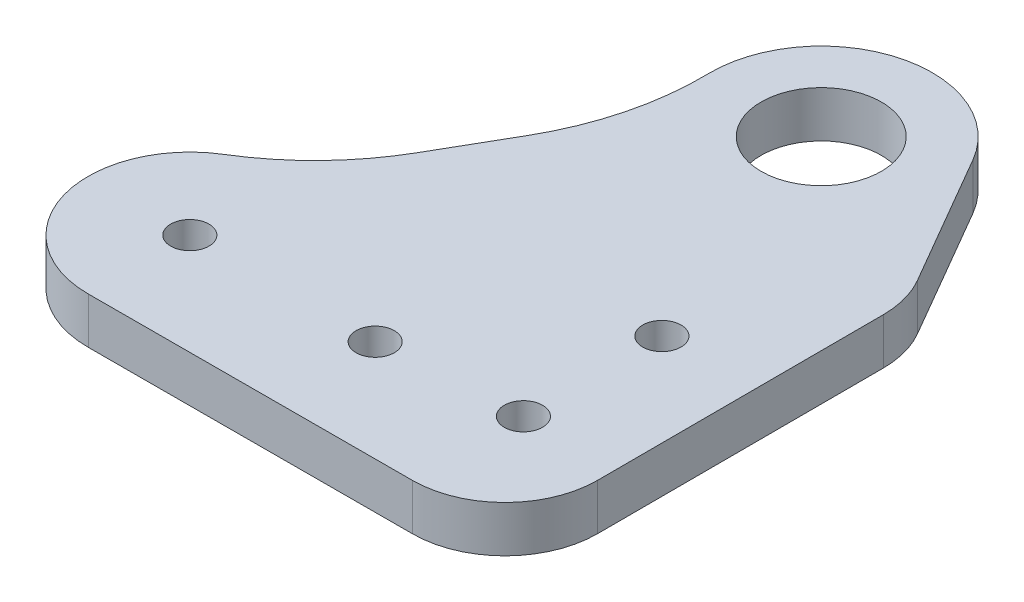
ISO-10303-21;
HEADER;
FILE_DESCRIPTION(('STEP AP214'),'2;1');
FILE_NAME('part.step','',(''),(''),'','','');
FILE_SCHEMA(('AUTOMOTIVE_DESIGN { 1 0 10303 214 1 1 1 1 }'));
ENDSEC;
DATA;
#1=APPLICATION_CONTEXT('core data for automotive mechanical design processes');
#2=APPLICATION_PROTOCOL_DEFINITION('international standard','automotive_design',2000,#1);
#3=PRODUCT_CONTEXT('',#1,'mechanical');
#4=PRODUCT('Part','Part','',(#3));
#5=PRODUCT_RELATED_PRODUCT_CATEGORY('part','',(#4));
#6=PRODUCT_DEFINITION_FORMATION('','',#4);
#7=PRODUCT_DEFINITION_CONTEXT('part definition',#1,'design');
#8=PRODUCT_DEFINITION('design','',#6,#7);
#9=PRODUCT_DEFINITION_SHAPE('','',#8);
#10=(LENGTH_UNIT() NAMED_UNIT(*) SI_UNIT(.MILLI.,.METRE.));
#11=(NAMED_UNIT(*) PLANE_ANGLE_UNIT() SI_UNIT($,.RADIAN.));
#12=(NAMED_UNIT(*) SI_UNIT($,.STERADIAN.) SOLID_ANGLE_UNIT());
#13=UNCERTAINTY_MEASURE_WITH_UNIT(LENGTH_MEASURE(1.E-05),#10,'distance_accuracy_value','');
#14=(GEOMETRIC_REPRESENTATION_CONTEXT(3) GLOBAL_UNCERTAINTY_ASSIGNED_CONTEXT((#13)) GLOBAL_UNIT_ASSIGNED_CONTEXT((#10,
#11,#12)) REPRESENTATION_CONTEXT('',''));
#15=CARTESIAN_POINT('',(0.,0.,0.));
#16=DIRECTION('',(0.,0.,1.));
#17=DIRECTION('',(1.,0.,0.));
#18=AXIS2_PLACEMENT_3D('',#15,#16,#17);
#19=CARTESIAN_POINT('',(18.9926734601036,5.,23.7671106439269));
#20=DIRECTION('',(0.,1.,0.));
#21=DIRECTION('',(0.,0.,1.));
#22=AXIS2_PLACEMENT_3D('',#19,#20,#21);
#23=PLANE('',#22);
#24=CARTESIAN_POINT('',(18.9589575027186,5.,6.76714407478896));
#25=DIRECTION('',(0.,1.,0.));
#26=DIRECTION('',(0.,0.,1.));
#27=AXIS2_PLACEMENT_3D('',#24,#25,#26);
#28=CIRCLE('',#27,2.06999999999918);
#29=CARTESIAN_POINT('',(18.9589575027186,5.,8.83714407478813));
#30=VERTEX_POINT('',#29);
#31=EDGE_CURVE('E265',#30,#30,#28,.T.);
#32=ORIENTED_EDGE('',*,*,#31,.F.);
#33=EDGE_LOOP('',(#32));
#34=FACE_BOUND('',#33,.T.);
#35=CARTESIAN_POINT('',(3.99071966935888,5.,22.7968619813518));
#36=DIRECTION('',(0.,1.,0.));
#37=DIRECTION('',(0.,0.,1.));
#38=AXIS2_PLACEMENT_3D('',#35,#36,#37);
#39=CIRCLE('',#38,2.06999999999918);
#40=CARTESIAN_POINT('',(3.99071966935888,5.,24.866861981351));
#41=VERTEX_POINT('',#40);
#42=EDGE_CURVE('E249',#41,#41,#39,.T.);
#43=ORIENTED_EDGE('',*,*,#42,.F.);
#44=EDGE_LOOP('',(#43));
#45=FACE_BOUND('',#44,.T.);
#46=CARTESIAN_POINT('',(18.9926734601036,5.,23.7671106439269));
#47=DIRECTION('',(0.,1.,0.));
#48=DIRECTION('',(0.,0.,1.));
#49=AXIS2_PLACEMENT_3D('',#46,#47,#48);
#50=CIRCLE('',#49,10.0000000000019);
#51=CARTESIAN_POINT('',(19.0125063762094,5.,33.7670909766814));
#52=VERTEX_POINT('',#51);
#53=CARTESIAN_POINT('',(28.9926537928581,5.,23.7472777278211));
#54=VERTEX_POINT('',#53);
#55=EDGE_CURVE('E182',#52,#54,#50,.T.);
#56=ORIENTED_EDGE('',*,*,#55,.T.);
#57=DIRECTION('',(-0.00198329161057745,0.,-0.99999803327526));
#58=VECTOR('',#57,1.);
#59=CARTESIAN_POINT('',(28.9926537928581,5.,23.7472777278211));
#60=LINE('',#59,#58);
#61=CARTESIAN_POINT('',(28.9312099072621,5.,-7.23342345858589));
#62=VERTEX_POINT('',#61);
#63=EDGE_CURVE('E106',#54,#62,#60,.T.);
#64=ORIENTED_EDGE('',*,*,#63,.T.);
#65=CARTESIAN_POINT('',(18.9312295745076,5.,-7.21359054248011));
#66=DIRECTION('',(0.,1.,0.));
#67=DIRECTION('',(0.,0.,1.));
#68=AXIS2_PLACEMENT_3D('',#65,#66,#67);
#69=CIRCLE('',#68,10.0000000000019);
#70=CARTESIAN_POINT('',(27.5815501219633,5.,-12.2307565180387));
#71=VERTEX_POINT('',#70);
#72=EDGE_CURVE('E211',#62,#71,#69,.T.);
#73=ORIENTED_EDGE('',*,*,#72,.T.);
#74=DIRECTION('',(-0.501716597555765,0.,-0.86503205474541));
#75=VECTOR('',#74,1.);
#76=CARTESIAN_POINT('',(27.5815501219633,5.,-12.2307565180387));
#77=LINE('',#76,#75);
#78=CARTESIAN_POINT('',(19.285215446797,5.,-26.5348386749323));
#79=VERTEX_POINT('',#78);
#80=EDGE_CURVE('E231',#71,#79,#77,.T.);
#81=ORIENTED_EDGE('',*,*,#80,.T.);
#82=CARTESIAN_POINT('',(8.90483078985219,5.,-20.5142395042632));
#83=DIRECTION('',(0.,1.,0.));
#84=DIRECTION('',(0.,0.,1.));
#85=AXIS2_PLACEMENT_3D('',#82,#83,#84);
#86=CIRCLE('',#85,11.9999999999998);
#87=CARTESIAN_POINT('',(-3.0928915145525,5.,-20.2804457781161));
#88=VERTEX_POINT('',#87);
#89=EDGE_CURVE('E227',#79,#88,#86,.T.);
#90=ORIENTED_EDGE('',*,*,#89,.T.);
#91=CARTESIAN_POINT('',(-33.0871972755709,5.,-19.6959614627483));
#92=DIRECTION('',(0.,-1.,0.));
#93=DIRECTION('',(0.,0.,1.));
#94=AXIS2_PLACEMENT_3D('',#91,#92,#93);
#95=CIRCLE('',#94,30.0000000000062);
#96=CARTESIAN_POINT('',(-7.07673688342201,5.,-4.74751839369167));
#97=VERTEX_POINT('',#96);
#98=EDGE_CURVE('E230',#88,#97,#95,.T.);
#99=ORIENTED_EDGE('',*,*,#98,.T.);
#100=DIRECTION('',(-0.498281435635117,0.,0.867015346404784));
#101=VECTOR('',#100,1.);
#102=CARTESIAN_POINT('',(-7.07673688342201,5.,-4.74751839369167));
#103=LINE('',#102,#101);
#104=CARTESIAN_POINT('',(-11.4343453038056,5.,2.83476965458697));
#105=VERTEX_POINT('',#104);
#106=EDGE_CURVE('E131',#97,#105,#103,.T.);
#107=ORIENTED_EDGE('',*,*,#106,.T.);
#108=CARTESIAN_POINT('',(-37.4448056959545,5.,-12.1136734144696));
#109=DIRECTION('',(0.,-1.,0.));
#110=DIRECTION('',(0.,0.,1.));
#111=AXIS2_PLACEMENT_3D('',#108,#109,#110);
#112=CIRCLE('',#111,30.0000000000062);
#113=CARTESIAN_POINT('',(-21.7602461615812,5.,13.4596445597994));
#114=VERTEX_POINT('',#113);
#115=EDGE_CURVE('E125',#105,#114,#112,.T.);
#116=ORIENTED_EDGE('',*,*,#115,.T.);
#117=CARTESIAN_POINT('',(-16.0092409989788,5.,22.8365278170294));
#118=DIRECTION('',(0.,1.,0.));
#119=DIRECTION('',(0.,0.,1.));
#120=AXIS2_PLACEMENT_3D('',#117,#118,#119);
#121=CIRCLE('',#120,11.);
#122=CARTESIAN_POINT('',(-15.9874247912625,5.,33.8365061830573));
#123=VERTEX_POINT('',#122);
#124=EDGE_CURVE('E129',#114,#123,#121,.T.);
#125=ORIENTED_EDGE('',*,*,#124,.T.);
#126=DIRECTION('',(0.99999803327526,0.,-0.00198329161057758));
#127=VECTOR('',#126,1.);
#128=CARTESIAN_POINT('',(-15.9874247912625,5.,33.8365061830573));
#129=LINE('',#128,#127);
#130=EDGE_CURVE('E57',#123,#52,#129,.T.);
#131=ORIENTED_EDGE('',*,*,#130,.T.);
#132=EDGE_LOOP('',(#56,#64,#73,#81,#90,#99,#107,#116,#125,#131));
#133=FACE_BOUND('',#132,.T.);
#134=CARTESIAN_POINT('',(-16.0092409989788,5.,22.8365278170294));
#135=DIRECTION('',(0.,1.,0.));
#136=DIRECTION('',(0.,0.,1.));
#137=AXIS2_PLACEMENT_3D('',#134,#135,#136);
#138=CIRCLE('',#137,2.07000000372127);
#139=CARTESIAN_POINT('',(-16.0092409989788,5.,24.9065278207507));
#140=VERTEX_POINT('',#139);
#141=EDGE_CURVE('E158',#140,#140,#138,.T.);
#142=ORIENTED_EDGE('',*,*,#141,.F.);
#143=EDGE_LOOP('',(#142));
#144=FACE_BOUND('',#143,.T.);
#145=CARTESIAN_POINT('',(18.9887068768774,5.,21.767114573918));
#146=DIRECTION('',(0.,1.,0.));
#147=DIRECTION('',(0.,0.,1.));
#148=AXIS2_PLACEMENT_3D('',#145,#146,#147);
#149=CIRCLE('',#148,2.06999999999911);
#150=CARTESIAN_POINT('',(18.9887068768774,5.,23.8371145739171));
#151=VERTEX_POINT('',#150);
#152=EDGE_CURVE('E257',#151,#151,#149,.T.);
#153=ORIENTED_EDGE('',*,*,#152,.F.);
#154=EDGE_LOOP('',(#153));
#155=FACE_BOUND('',#154,.T.);
#156=CARTESIAN_POINT('',(8.9048307898522,5.,-20.5142395042632));
#157=DIRECTION('',(0.,1.,0.));
#158=DIRECTION('',(0.,0.,1.));
#159=AXIS2_PLACEMENT_3D('',#156,#157,#158);
#160=CIRCLE('',#159,6.49999999999992);
#161=CARTESIAN_POINT('',(8.9048307898522,5.,-14.0142395042633));
#162=VERTEX_POINT('',#161);
#163=EDGE_CURVE('E273',#162,#162,#160,.T.);
#164=ORIENTED_EDGE('',*,*,#163,.F.);
#165=EDGE_LOOP('',(#164));
#166=FACE_BOUND('',#165,.T.);
#167=ADVANCED_FACE('F39',(#34,#45,#133,#144,#155,#166),#23,.T.);
#168=CARTESIAN_POINT('',(18.9926734601036,0.,23.7671106439269));
#169=DIRECTION('',(0.,1.,0.));
#170=DIRECTION('',(0.,0.,1.));
#171=AXIS2_PLACEMENT_3D('',#168,#169,#170);
#172=PLANE('',#171);
#173=CARTESIAN_POINT('',(18.9926734601036,0.,23.7671106439269));
#174=DIRECTION('',(0.,1.,0.));
#175=DIRECTION('',(0.,0.,1.));
#176=AXIS2_PLACEMENT_3D('',#173,#174,#175);
#177=CIRCLE('',#176,10.0000000000019);
#178=CARTESIAN_POINT('',(19.0125063762094,0.,33.7670909766814));
#179=VERTEX_POINT('',#178);
#180=CARTESIAN_POINT('',(28.9926537928581,0.,23.7472777278211));
#181=VERTEX_POINT('',#180);
#182=EDGE_CURVE('E153',#179,#181,#177,.T.);
#183=ORIENTED_EDGE('',*,*,#182,.F.);
#184=DIRECTION('',(0.99999803327526,0.,-0.00198329161057758));
#185=VECTOR('',#184,1.);
#186=CARTESIAN_POINT('',(-15.9874247912625,0.,33.8365061830573));
#187=LINE('',#186,#185);
#188=CARTESIAN_POINT('',(-15.9874247912625,0.,33.8365061830573));
#189=VERTEX_POINT('',#188);
#190=EDGE_CURVE('E98',#189,#179,#187,.T.);
#191=ORIENTED_EDGE('',*,*,#190,.F.);
#192=CARTESIAN_POINT('',(-16.0092409989788,0.,22.8365278170294));
#193=DIRECTION('',(0.,1.,0.));
#194=DIRECTION('',(0.,0.,1.));
#195=AXIS2_PLACEMENT_3D('',#192,#193,#194);
#196=CIRCLE('',#195,11.);
#197=CARTESIAN_POINT('',(-21.7602461615812,0.,13.4596445597994));
#198=VERTEX_POINT('',#197);
#199=EDGE_CURVE('E92',#198,#189,#196,.T.);
#200=ORIENTED_EDGE('',*,*,#199,.F.);
#201=CARTESIAN_POINT('',(-37.4448056959545,0.,-12.1136734144696));
#202=DIRECTION('',(0.,-1.,0.));
#203=DIRECTION('',(0.,0.,1.));
#204=AXIS2_PLACEMENT_3D('',#201,#202,#203);
#205=CIRCLE('',#204,30.0000000000062);
#206=CARTESIAN_POINT('',(-11.4343453038056,0.,2.83476965458697));
#207=VERTEX_POINT('',#206);
#208=EDGE_CURVE('E140',#207,#198,#205,.T.);
#209=ORIENTED_EDGE('',*,*,#208,.F.);
#210=DIRECTION('',(-0.498281435635117,0.,0.867015346404784));
#211=VECTOR('',#210,1.);
#212=CARTESIAN_POINT('',(-7.07673688342201,0.,-4.74751839369167));
#213=LINE('',#212,#211);
#214=CARTESIAN_POINT('',(-7.07673688342201,0.,-4.74751839369167));
#215=VERTEX_POINT('',#214);
#216=EDGE_CURVE('E173',#215,#207,#213,.T.);
#217=ORIENTED_EDGE('',*,*,#216,.F.);
#218=CARTESIAN_POINT('',(-33.0871972755709,0.,-19.6959614627483));
#219=DIRECTION('',(0.,-1.,0.));
#220=DIRECTION('',(0.,0.,1.));
#221=AXIS2_PLACEMENT_3D('',#218,#219,#220);
#222=CIRCLE('',#221,30.0000000000062);
#223=CARTESIAN_POINT('',(-3.0928915145525,0.,-20.2804457781161));
#224=VERTEX_POINT('',#223);
#225=EDGE_CURVE('E170',#224,#215,#222,.T.);
#226=ORIENTED_EDGE('',*,*,#225,.F.);
#227=CARTESIAN_POINT('',(8.90483078985219,0.,-20.5142395042632));
#228=DIRECTION('',(0.,1.,0.));
#229=DIRECTION('',(0.,0.,1.));
#230=AXIS2_PLACEMENT_3D('',#227,#228,#229);
#231=CIRCLE('',#230,11.9999999999998);
#232=CARTESIAN_POINT('',(19.285215446797,0.,-26.5348386749323));
#233=VERTEX_POINT('',#232);
#234=EDGE_CURVE('E167',#233,#224,#231,.T.);
#235=ORIENTED_EDGE('',*,*,#234,.F.);
#236=DIRECTION('',(-0.501716597555765,0.,-0.86503205474541));
#237=VECTOR('',#236,1.);
#238=CARTESIAN_POINT('',(27.5815501219633,0.,-12.2307565180387));
#239=LINE('',#238,#237);
#240=CARTESIAN_POINT('',(27.5815501219633,0.,-12.2307565180387));
#241=VERTEX_POINT('',#240);
#242=EDGE_CURVE('E164',#241,#233,#239,.T.);
#243=ORIENTED_EDGE('',*,*,#242,.F.);
#244=CARTESIAN_POINT('',(18.9312295745076,0.,-7.21359054248011));
#245=DIRECTION('',(0.,1.,0.));
#246=DIRECTION('',(0.,0.,1.));
#247=AXIS2_PLACEMENT_3D('',#244,#245,#246);
#248=CIRCLE('',#247,10.0000000000019);
#249=CARTESIAN_POINT('',(28.9312099072621,0.,-7.23342345858589));
#250=VERTEX_POINT('',#249);
#251=EDGE_CURVE('E161',#250,#241,#248,.T.);
#252=ORIENTED_EDGE('',*,*,#251,.F.);
#253=DIRECTION('',(-0.00198329161057745,0.,-0.99999803327526));
#254=VECTOR('',#253,1.);
#255=CARTESIAN_POINT('',(28.9926537928581,0.,23.7472777278211));
#256=LINE('',#255,#254);
#257=EDGE_CURVE('E157',#181,#250,#256,.T.);
#258=ORIENTED_EDGE('',*,*,#257,.F.);
#259=EDGE_LOOP('',(#183,#191,#200,#209,#217,#226,#235,#243,#252,#258));
#260=FACE_BOUND('',#259,.T.);
#261=CARTESIAN_POINT('',(-16.0092409989788,0.,22.8365278170294));
#262=DIRECTION('',(0.,1.,0.));
#263=DIRECTION('',(0.,0.,1.));
#264=AXIS2_PLACEMENT_3D('',#261,#262,#263);
#265=CIRCLE('',#264,2.07000000372127);
#266=CARTESIAN_POINT('',(-16.0092409989788,0.,24.9065278207507));
#267=VERTEX_POINT('',#266);
#268=EDGE_CURVE('E245',#267,#267,#265,.T.);
#269=ORIENTED_EDGE('',*,*,#268,.T.);
#270=EDGE_LOOP('',(#269));
#271=FACE_BOUND('',#270,.T.);
#272=CARTESIAN_POINT('',(3.99071966935888,0.,22.7968619813518));
#273=DIRECTION('',(0.,1.,0.));
#274=DIRECTION('',(0.,0.,1.));
#275=AXIS2_PLACEMENT_3D('',#272,#273,#274);
#276=CIRCLE('',#275,2.06999999999918);
#277=CARTESIAN_POINT('',(3.99071966935888,0.,24.866861981351));
#278=VERTEX_POINT('',#277);
#279=EDGE_CURVE('E253',#278,#278,#276,.T.);
#280=ORIENTED_EDGE('',*,*,#279,.T.);
#281=EDGE_LOOP('',(#280));
#282=FACE_BOUND('',#281,.T.);
#283=CARTESIAN_POINT('',(18.9887068768774,0.,21.767114573918));
#284=DIRECTION('',(0.,1.,0.));
#285=DIRECTION('',(0.,0.,1.));
#286=AXIS2_PLACEMENT_3D('',#283,#284,#285);
#287=CIRCLE('',#286,2.06999999999911);
#288=CARTESIAN_POINT('',(18.9887068768774,0.,23.8371145739171));
#289=VERTEX_POINT('',#288);
#290=EDGE_CURVE('E261',#289,#289,#287,.T.);
#291=ORIENTED_EDGE('',*,*,#290,.T.);
#292=EDGE_LOOP('',(#291));
#293=FACE_BOUND('',#292,.T.);
#294=CARTESIAN_POINT('',(18.9589575027186,0.,6.76714407478896));
#295=DIRECTION('',(0.,1.,0.));
#296=DIRECTION('',(0.,0.,1.));
#297=AXIS2_PLACEMENT_3D('',#294,#295,#296);
#298=CIRCLE('',#297,2.06999999999918);
#299=CARTESIAN_POINT('',(18.9589575027186,0.,8.83714407478813));
#300=VERTEX_POINT('',#299);
#301=EDGE_CURVE('E269',#300,#300,#298,.T.);
#302=ORIENTED_EDGE('',*,*,#301,.T.);
#303=EDGE_LOOP('',(#302));
#304=FACE_BOUND('',#303,.T.);
#305=CARTESIAN_POINT('',(8.9048307898522,0.,-20.5142395042632));
#306=DIRECTION('',(0.,1.,0.));
#307=DIRECTION('',(0.,0.,1.));
#308=AXIS2_PLACEMENT_3D('',#305,#306,#307);
#309=CIRCLE('',#308,6.49999999999992);
#310=CARTESIAN_POINT('',(8.9048307898522,0.,-14.0142395042633));
#311=VERTEX_POINT('',#310);
#312=EDGE_CURVE('E277',#311,#311,#309,.T.);
#313=ORIENTED_EDGE('',*,*,#312,.T.);
#314=EDGE_LOOP('',(#313));
#315=FACE_BOUND('',#314,.T.);
#316=ADVANCED_FACE('F215',(#260,#271,#282,#293,#304,#315),#172,.F.);
#317=CARTESIAN_POINT('',(18.9926734601036,5.,23.7671106439269));
#318=DIRECTION('',(0.,-1.,0.));
#319=DIRECTION('',(0.,0.,-1.));
#320=AXIS2_PLACEMENT_3D('',#317,#318,#319);
#321=CYLINDRICAL_SURFACE('',#320,10.0000000000019);
#322=ORIENTED_EDGE('',*,*,#182,.T.);
#323=DIRECTION('',(0.,-1.,0.));
#324=VECTOR('',#323,1.);
#325=CARTESIAN_POINT('',(28.9926537928581,5.,23.7472777278211));
#326=LINE('',#325,#324);
#327=EDGE_CURVE('E11',#54,#181,#326,.T.);
#328=ORIENTED_EDGE('',*,*,#327,.F.);
#329=ORIENTED_EDGE('',*,*,#55,.F.);
#330=DIRECTION('',(0.,-1.,0.));
#331=VECTOR('',#330,1.);
#332=CARTESIAN_POINT('',(19.0125063762094,5.,33.7670909766814));
#333=LINE('',#332,#331);
#334=EDGE_CURVE('E149',#52,#179,#333,.T.);
#335=ORIENTED_EDGE('',*,*,#334,.T.);
#336=EDGE_LOOP('',(#322,#328,#329,#335));
#337=FACE_BOUND('',#336,.T.);
#338=ADVANCED_FACE('F41',(#337),#321,.T.);
#339=CARTESIAN_POINT('',(28.9926537928581,5.,23.7472777278211));
#340=DIRECTION('',(-0.99999803327526,0.,0.00198329161057745));
#341=DIRECTION('',(0.00198329161057745,0.,0.99999803327526));
#342=AXIS2_PLACEMENT_3D('',#339,#340,#341);
#343=PLANE('',#342);
#344=ORIENTED_EDGE('',*,*,#257,.T.);
#345=DIRECTION('',(0.,-1.,0.));
#346=VECTOR('',#345,1.);
#347=CARTESIAN_POINT('',(28.9312099072621,5.,-7.23342345858589));
#348=LINE('',#347,#346);
#349=EDGE_CURVE('E49',#62,#250,#348,.T.);
#350=ORIENTED_EDGE('',*,*,#349,.F.);
#351=ORIENTED_EDGE('',*,*,#63,.F.);
#352=ORIENTED_EDGE('',*,*,#327,.T.);
#353=EDGE_LOOP('',(#344,#350,#351,#352));
#354=FACE_BOUND('',#353,.T.);
#355=ADVANCED_FACE('F321',(#354),#343,.F.);
#356=CARTESIAN_POINT('',(18.9312295745076,5.,-7.21359054248011));
#357=DIRECTION('',(0.,-1.,0.));
#358=DIRECTION('',(0.,0.,-1.));
#359=AXIS2_PLACEMENT_3D('',#356,#357,#358);
#360=CYLINDRICAL_SURFACE('',#359,10.0000000000019);
#361=ORIENTED_EDGE('',*,*,#251,.T.);
#362=DIRECTION('',(0.,-1.,0.));
#363=VECTOR('',#362,1.);
#364=CARTESIAN_POINT('',(27.5815501219633,5.,-12.2307565180387));
#365=LINE('',#364,#363);
#366=EDGE_CURVE('E201',#71,#241,#365,.T.);
#367=ORIENTED_EDGE('',*,*,#366,.F.);
#368=ORIENTED_EDGE('',*,*,#72,.F.);
#369=ORIENTED_EDGE('',*,*,#349,.T.);
#370=EDGE_LOOP('',(#361,#367,#368,#369));
#371=FACE_BOUND('',#370,.T.);
#372=ADVANCED_FACE('F209',(#371),#360,.T.);
#373=CARTESIAN_POINT('',(27.5815501219633,5.,-12.2307565180387));
#374=DIRECTION('',(-0.86503205474541,0.,0.501716597555765));
#375=DIRECTION('',(0.501716597555765,0.,0.86503205474541));
#376=AXIS2_PLACEMENT_3D('',#373,#374,#375);
#377=PLANE('',#376);
#378=ORIENTED_EDGE('',*,*,#242,.T.);
#379=DIRECTION('',(0.,-1.,0.));
#380=VECTOR('',#379,1.);
#381=CARTESIAN_POINT('',(19.285215446797,5.,-26.5348386749323));
#382=LINE('',#381,#380);
#383=EDGE_CURVE('E197',#79,#233,#382,.T.);
#384=ORIENTED_EDGE('',*,*,#383,.F.);
#385=ORIENTED_EDGE('',*,*,#80,.F.);
#386=ORIENTED_EDGE('',*,*,#366,.T.);
#387=EDGE_LOOP('',(#378,#384,#385,#386));
#388=FACE_BOUND('',#387,.T.);
#389=ADVANCED_FACE('F221',(#388),#377,.F.);
#390=CARTESIAN_POINT('',(8.90483078985219,5.,-20.5142395042632));
#391=DIRECTION('',(0.,-1.,0.));
#392=DIRECTION('',(0.,0.,-1.));
#393=AXIS2_PLACEMENT_3D('',#390,#391,#392);
#394=CYLINDRICAL_SURFACE('',#393,11.9999999999998);
#395=ORIENTED_EDGE('',*,*,#234,.T.);
#396=DIRECTION('',(0.,-1.,0.));
#397=VECTOR('',#396,1.);
#398=CARTESIAN_POINT('',(-3.0928915145525,5.,-20.2804457781161));
#399=LINE('',#398,#397);
#400=EDGE_CURVE('E193',#88,#224,#399,.T.);
#401=ORIENTED_EDGE('',*,*,#400,.F.);
#402=ORIENTED_EDGE('',*,*,#89,.F.);
#403=ORIENTED_EDGE('',*,*,#383,.T.);
#404=EDGE_LOOP('',(#395,#401,#402,#403));
#405=FACE_BOUND('',#404,.T.);
#406=ADVANCED_FACE('F225',(#405),#394,.T.);
#407=CARTESIAN_POINT('',(-33.0871972755709,5.,-19.6959614627483));
#408=DIRECTION('',(0.,-1.,0.));
#409=DIRECTION('',(0.,0.,-1.));
#410=AXIS2_PLACEMENT_3D('',#407,#408,#409);
#411=CYLINDRICAL_SURFACE('',#410,30.0000000000062);
#412=ORIENTED_EDGE('',*,*,#225,.T.);
#413=DIRECTION('',(0.,-1.,0.));
#414=VECTOR('',#413,1.);
#415=CARTESIAN_POINT('',(-7.07673688342201,5.,-4.74751839369167));
#416=LINE('',#415,#414);
#417=EDGE_CURVE('E189',#97,#215,#416,.T.);
#418=ORIENTED_EDGE('',*,*,#417,.F.);
#419=ORIENTED_EDGE('',*,*,#98,.F.);
#420=ORIENTED_EDGE('',*,*,#400,.T.);
#421=EDGE_LOOP('',(#412,#418,#419,#420));
#422=FACE_BOUND('',#421,.T.);
#423=ADVANCED_FACE('F311',(#422),#411,.F.);
#424=CARTESIAN_POINT('',(-7.07673688342201,5.,-4.74751839369167));
#425=DIRECTION('',(0.867015346404784,0.,0.498281435635117));
#426=DIRECTION('',(0.498281435635117,0.,-0.867015346404784));
#427=AXIS2_PLACEMENT_3D('',#424,#425,#426);
#428=PLANE('',#427);
#429=ORIENTED_EDGE('',*,*,#216,.T.);
#430=DIRECTION('',(0.,-1.,0.));
#431=VECTOR('',#430,1.);
#432=CARTESIAN_POINT('',(-11.4343453038056,5.,2.83476965458697));
#433=LINE('',#432,#431);
#434=EDGE_CURVE('E142',#105,#207,#433,.T.);
#435=ORIENTED_EDGE('',*,*,#434,.F.);
#436=ORIENTED_EDGE('',*,*,#106,.F.);
#437=ORIENTED_EDGE('',*,*,#417,.T.);
#438=EDGE_LOOP('',(#429,#435,#436,#437));
#439=FACE_BOUND('',#438,.T.);
#440=ADVANCED_FACE('F308',(#439),#428,.F.);
#441=CARTESIAN_POINT('',(-37.4448056959545,5.,-12.1136734144696));
#442=DIRECTION('',(0.,-1.,0.));
#443=DIRECTION('',(0.,0.,-1.));
#444=AXIS2_PLACEMENT_3D('',#441,#442,#443);
#445=CYLINDRICAL_SURFACE('',#444,30.0000000000062);
#446=ORIENTED_EDGE('',*,*,#208,.T.);
#447=DIRECTION('',(0.,-1.,0.));
#448=VECTOR('',#447,1.);
#449=CARTESIAN_POINT('',(-21.7602461615812,5.,13.4596445597994));
#450=LINE('',#449,#448);
#451=EDGE_CURVE('E137',#114,#198,#450,.T.);
#452=ORIENTED_EDGE('',*,*,#451,.F.);
#453=ORIENTED_EDGE('',*,*,#115,.F.);
#454=ORIENTED_EDGE('',*,*,#434,.T.);
#455=EDGE_LOOP('',(#446,#452,#453,#454));
#456=FACE_BOUND('',#455,.T.);
#457=ADVANCED_FACE('F138',(#456),#445,.F.);
#458=CARTESIAN_POINT('',(-16.0092409989788,5.,22.8365278170294));
#459=DIRECTION('',(0.,-1.,0.));
#460=DIRECTION('',(0.,0.,-1.));
#461=AXIS2_PLACEMENT_3D('',#458,#459,#460);
#462=CYLINDRICAL_SURFACE('',#461,11.);
#463=ORIENTED_EDGE('',*,*,#199,.T.);
#464=DIRECTION('',(0.,-1.,0.));
#465=VECTOR('',#464,1.);
#466=CARTESIAN_POINT('',(-15.9874247912625,5.,33.8365061830573));
#467=LINE('',#466,#465);
#468=EDGE_CURVE('E143',#123,#189,#467,.T.);
#469=ORIENTED_EDGE('',*,*,#468,.F.);
#470=ORIENTED_EDGE('',*,*,#124,.F.);
#471=ORIENTED_EDGE('',*,*,#451,.T.);
#472=EDGE_LOOP('',(#463,#469,#470,#471));
#473=FACE_BOUND('',#472,.T.);
#474=ADVANCED_FACE('F145',(#473),#462,.T.);
#475=CARTESIAN_POINT('',(-15.9874247912625,5.,33.8365061830573));
#476=DIRECTION('',(-0.00198329161057758,0.,-0.99999803327526));
#477=DIRECTION('',(-0.99999803327526,0.,0.00198329161057758));
#478=AXIS2_PLACEMENT_3D('',#475,#476,#477);
#479=PLANE('',#478);
#480=ORIENTED_EDGE('',*,*,#190,.T.);
#481=ORIENTED_EDGE('',*,*,#334,.F.);
#482=ORIENTED_EDGE('',*,*,#130,.F.);
#483=ORIENTED_EDGE('',*,*,#468,.T.);
#484=EDGE_LOOP('',(#480,#481,#482,#483));
#485=FACE_BOUND('',#484,.T.);
#486=ADVANCED_FACE('F301',(#485),#479,.F.);
#487=CARTESIAN_POINT('',(-16.0092409989788,5.,22.8365278170294));
#488=DIRECTION('',(0.,-1.,0.));
#489=DIRECTION('',(0.,0.,-1.));
#490=AXIS2_PLACEMENT_3D('',#487,#488,#489);
#491=CYLINDRICAL_SURFACE('',#490,2.07000000372127);
#492=ORIENTED_EDGE('',*,*,#141,.T.);
#493=EDGE_LOOP('',(#492));
#494=FACE_BOUND('',#493,.T.);
#495=ORIENTED_EDGE('',*,*,#268,.F.);
#496=EDGE_LOOP('',(#495));
#497=FACE_BOUND('',#496,.T.);
#498=ADVANCED_FACE('F298',(#494,#497),#491,.F.);
#499=CARTESIAN_POINT('',(3.99071966935888,5.,22.7968619813518));
#500=DIRECTION('',(0.,-1.,0.));
#501=DIRECTION('',(0.,0.,-1.));
#502=AXIS2_PLACEMENT_3D('',#499,#500,#501);
#503=CYLINDRICAL_SURFACE('',#502,2.06999999999918);
#504=ORIENTED_EDGE('',*,*,#42,.T.);
#505=EDGE_LOOP('',(#504));
#506=FACE_BOUND('',#505,.T.);
#507=ORIENTED_EDGE('',*,*,#279,.F.);
#508=EDGE_LOOP('',(#507));
#509=FACE_BOUND('',#508,.T.);
#510=ADVANCED_FACE('F397',(#506,#509),#503,.F.);
#511=CARTESIAN_POINT('',(18.9887068768774,5.,21.767114573918));
#512=DIRECTION('',(0.,-1.,0.));
#513=DIRECTION('',(0.,0.,-1.));
#514=AXIS2_PLACEMENT_3D('',#511,#512,#513);
#515=CYLINDRICAL_SURFACE('',#514,2.06999999999911);
#516=ORIENTED_EDGE('',*,*,#152,.T.);
#517=EDGE_LOOP('',(#516));
#518=FACE_BOUND('',#517,.T.);
#519=ORIENTED_EDGE('',*,*,#290,.F.);
#520=EDGE_LOOP('',(#519));
#521=FACE_BOUND('',#520,.T.);
#522=ADVANCED_FACE('F405',(#518,#521),#515,.F.);
#523=CARTESIAN_POINT('',(18.9589575027186,5.,6.76714407478896));
#524=DIRECTION('',(0.,-1.,0.));
#525=DIRECTION('',(0.,0.,-1.));
#526=AXIS2_PLACEMENT_3D('',#523,#524,#525);
#527=CYLINDRICAL_SURFACE('',#526,2.06999999999918);
#528=ORIENTED_EDGE('',*,*,#31,.T.);
#529=EDGE_LOOP('',(#528));
#530=FACE_BOUND('',#529,.T.);
#531=ORIENTED_EDGE('',*,*,#301,.F.);
#532=EDGE_LOOP('',(#531));
#533=FACE_BOUND('',#532,.T.);
#534=ADVANCED_FACE('F413',(#530,#533),#527,.F.);
#535=CARTESIAN_POINT('',(8.9048307898522,5.,-20.5142395042632));
#536=DIRECTION('',(0.,-1.,0.));
#537=DIRECTION('',(0.,0.,-1.));
#538=AXIS2_PLACEMENT_3D('',#535,#536,#537);
#539=CYLINDRICAL_SURFACE('',#538,6.49999999999992);
#540=ORIENTED_EDGE('',*,*,#163,.T.);
#541=EDGE_LOOP('',(#540));
#542=FACE_BOUND('',#541,.T.);
#543=ORIENTED_EDGE('',*,*,#312,.F.);
#544=EDGE_LOOP('',(#543));
#545=FACE_BOUND('',#544,.T.);
#546=ADVANCED_FACE('F285',(#542,#545),#539,.F.);
#547=CLOSED_SHELL('',(#167,#316,#338,#355,#372,#389,#406,#423,#440,#457,#474,#486,#498,#510,
#522,#534,#546));
#548=MANIFOLD_SOLID_BREP('B2',#547);
#549=ADVANCED_BREP_SHAPE_REPRESENTATION('',(#18,#548),#14);
#550=SHAPE_DEFINITION_REPRESENTATION(#9,#549);
ENDSEC;
END-ISO-10303-21;
